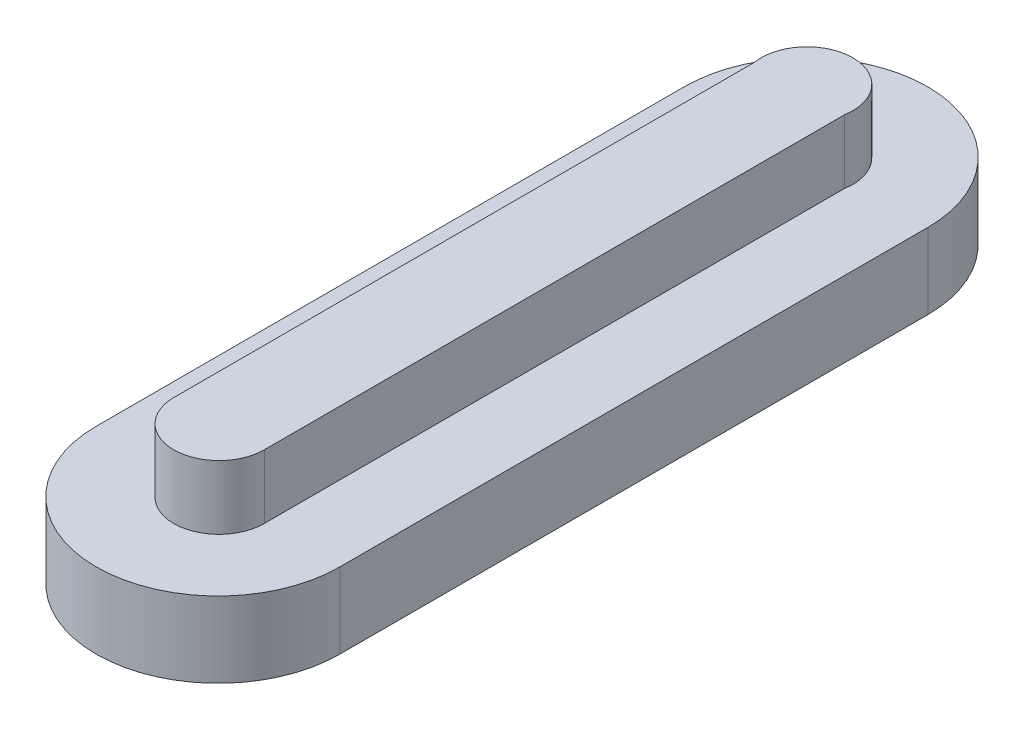
ISO-10303-21;
HEADER;
FILE_DESCRIPTION(('STEP AP214'),'2;1');
FILE_NAME('part.step','',(''),(''),'','','');
FILE_SCHEMA(('AUTOMOTIVE_DESIGN { 1 0 10303 214 1 1 1 1 }'));
ENDSEC;
DATA;
#1=APPLICATION_CONTEXT('core data for automotive mechanical design processes');
#2=APPLICATION_PROTOCOL_DEFINITION('international standard','automotive_design',2000,#1);
#3=PRODUCT_CONTEXT('',#1,'mechanical');
#4=PRODUCT('Part','Part','',(#3));
#5=PRODUCT_RELATED_PRODUCT_CATEGORY('part','',(#4));
#6=PRODUCT_DEFINITION_FORMATION('','',#4);
#7=PRODUCT_DEFINITION_CONTEXT('part definition',#1,'design');
#8=PRODUCT_DEFINITION('design','',#6,#7);
#9=PRODUCT_DEFINITION_SHAPE('','',#8);
#10=(LENGTH_UNIT() NAMED_UNIT(*) SI_UNIT(.MILLI.,.METRE.));
#11=(NAMED_UNIT(*) PLANE_ANGLE_UNIT() SI_UNIT($,.RADIAN.));
#12=(NAMED_UNIT(*) SI_UNIT($,.STERADIAN.) SOLID_ANGLE_UNIT());
#13=UNCERTAINTY_MEASURE_WITH_UNIT(LENGTH_MEASURE(1.E-05),#10,'distance_accuracy_value','');
#14=(GEOMETRIC_REPRESENTATION_CONTEXT(3) GLOBAL_UNCERTAINTY_ASSIGNED_CONTEXT((#13)) GLOBAL_UNIT_ASSIGNED_CONTEXT((#10,
#11,#12)) REPRESENTATION_CONTEXT('',''));
#15=CARTESIAN_POINT('',(0.,0.,0.));
#16=DIRECTION('',(0.,0.,1.));
#17=DIRECTION('',(1.,0.,0.));
#18=AXIS2_PLACEMENT_3D('',#15,#16,#17);
#19=CARTESIAN_POINT('',(0.,4.5,0.));
#20=DIRECTION('',(0.,-1.,0.));
#21=DIRECTION('',(0.,0.,-1.));
#22=AXIS2_PLACEMENT_3D('',#19,#20,#21);
#23=CYLINDRICAL_SURFACE('',#22,7.25);
#24=CARTESIAN_POINT('',(0.,0.,0.));
#25=DIRECTION('',(0.,1.,0.));
#26=DIRECTION('',(0.,0.,1.));
#27=AXIS2_PLACEMENT_3D('',#24,#25,#26);
#28=CIRCLE('',#27,7.25);
#29=CARTESIAN_POINT('',(7.25,0.,0.));
#30=VERTEX_POINT('',#29);
#31=CARTESIAN_POINT('',(-7.25,0.,0.));
#32=VERTEX_POINT('',#31);
#33=EDGE_CURVE('E151',#30,#32,#28,.T.);
#34=ORIENTED_EDGE('',*,*,#33,.T.);
#35=DIRECTION('',(0.,-1.,0.));
#36=VECTOR('',#35,1.);
#37=CARTESIAN_POINT('',(-7.25,4.5,0.));
#38=LINE('',#37,#36);
#39=CARTESIAN_POINT('',(-7.25,4.5,0.));
#40=VERTEX_POINT('',#39);
#41=EDGE_CURVE('E11',#40,#32,#38,.T.);
#42=ORIENTED_EDGE('',*,*,#41,.F.);
#43=CARTESIAN_POINT('',(0.,4.5,0.));
#44=DIRECTION('',(0.,1.,0.));
#45=DIRECTION('',(0.,0.,1.));
#46=AXIS2_PLACEMENT_3D('',#43,#44,#45);
#47=CIRCLE('',#46,7.25);
#48=CARTESIAN_POINT('',(7.25,4.5,0.));
#49=VERTEX_POINT('',#48);
#50=EDGE_CURVE('E152',#49,#40,#47,.T.);
#51=ORIENTED_EDGE('',*,*,#50,.F.);
#52=DIRECTION('',(0.,-1.,0.));
#53=VECTOR('',#52,1.);
#54=CARTESIAN_POINT('',(7.25,4.5,0.));
#55=LINE('',#54,#53);
#56=EDGE_CURVE('E166',#49,#30,#55,.T.);
#57=ORIENTED_EDGE('',*,*,#56,.T.);
#58=EDGE_LOOP('',(#34,#42,#51,#57));
#59=FACE_BOUND('',#58,.T.);
#60=ADVANCED_FACE('F38',(#59),#23,.T.);
#61=CARTESIAN_POINT('',(-7.25,4.5,0.));
#62=DIRECTION('',(1.,0.,0.));
#63=DIRECTION('',(0.,0.,-1.));
#64=AXIS2_PLACEMENT_3D('',#61,#62,#63);
#65=PLANE('',#64);
#66=DIRECTION('',(0.,0.,1.));
#67=VECTOR('',#66,1.);
#68=CARTESIAN_POINT('',(-7.25,0.,0.));
#69=LINE('',#68,#67);
#70=CARTESIAN_POINT('',(-7.24999999999999,0.,35.));
#71=VERTEX_POINT('',#70);
#72=EDGE_CURVE('E170',#32,#71,#69,.T.);
#73=ORIENTED_EDGE('',*,*,#72,.T.);
#74=DIRECTION('',(0.,-1.,0.));
#75=VECTOR('',#74,1.);
#76=CARTESIAN_POINT('',(-7.24999999999999,4.5,35.));
#77=LINE('',#76,#75);
#78=CARTESIAN_POINT('',(-7.24999999999999,4.5,35.));
#79=VERTEX_POINT('',#78);
#80=EDGE_CURVE('E46',#79,#71,#77,.T.);
#81=ORIENTED_EDGE('',*,*,#80,.F.);
#82=DIRECTION('',(0.,0.,1.));
#83=VECTOR('',#82,1.);
#84=CARTESIAN_POINT('',(-7.25,4.5,0.));
#85=LINE('',#84,#83);
#86=EDGE_CURVE('E156',#40,#79,#85,.T.);
#87=ORIENTED_EDGE('',*,*,#86,.F.);
#88=ORIENTED_EDGE('',*,*,#41,.T.);
#89=EDGE_LOOP('',(#73,#81,#87,#88));
#90=FACE_BOUND('',#89,.T.);
#91=ADVANCED_FACE('F206',(#90),#65,.F.);
#92=CARTESIAN_POINT('',(0.,4.5,35.));
#93=DIRECTION('',(0.,-1.,0.));
#94=DIRECTION('',(0.,0.,-1.));
#95=AXIS2_PLACEMENT_3D('',#92,#93,#94);
#96=CYLINDRICAL_SURFACE('',#95,7.25);
#97=CARTESIAN_POINT('',(0.,0.,35.));
#98=DIRECTION('',(0.,1.,0.));
#99=DIRECTION('',(0.,0.,1.));
#100=AXIS2_PLACEMENT_3D('',#97,#98,#99);
#101=CIRCLE('',#100,7.25);
#102=CARTESIAN_POINT('',(7.25,0.,35.));
#103=VERTEX_POINT('',#102);
#104=EDGE_CURVE('E173',#71,#103,#101,.T.);
#105=ORIENTED_EDGE('',*,*,#104,.T.);
#106=DIRECTION('',(0.,-1.,0.));
#107=VECTOR('',#106,1.);
#108=CARTESIAN_POINT('',(7.25,4.5,35.));
#109=LINE('',#108,#107);
#110=CARTESIAN_POINT('',(7.25,4.5,35.));
#111=VERTEX_POINT('',#110);
#112=EDGE_CURVE('E181',#111,#103,#109,.T.);
#113=ORIENTED_EDGE('',*,*,#112,.F.);
#114=CARTESIAN_POINT('',(0.,4.5,35.));
#115=DIRECTION('',(0.,1.,0.));
#116=DIRECTION('',(0.,0.,1.));
#117=AXIS2_PLACEMENT_3D('',#114,#115,#116);
#118=CIRCLE('',#117,7.25);
#119=EDGE_CURVE('E160',#79,#111,#118,.T.);
#120=ORIENTED_EDGE('',*,*,#119,.F.);
#121=ORIENTED_EDGE('',*,*,#80,.T.);
#122=EDGE_LOOP('',(#105,#113,#120,#121));
#123=FACE_BOUND('',#122,.T.);
#124=ADVANCED_FACE('F190',(#123),#96,.T.);
#125=CARTESIAN_POINT('',(7.25,4.5,0.));
#126=DIRECTION('',(-1.,0.,0.));
#127=DIRECTION('',(0.,0.,1.));
#128=AXIS2_PLACEMENT_3D('',#125,#126,#127);
#129=PLANE('',#128);
#130=DIRECTION('',(0.,0.,-1.));
#131=VECTOR('',#130,1.);
#132=CARTESIAN_POINT('',(7.25,0.,0.));
#133=LINE('',#132,#131);
#134=EDGE_CURVE('E157',#103,#30,#133,.T.);
#135=ORIENTED_EDGE('',*,*,#134,.T.);
#136=ORIENTED_EDGE('',*,*,#56,.F.);
#137=DIRECTION('',(0.,0.,-1.));
#138=VECTOR('',#137,1.);
#139=CARTESIAN_POINT('',(7.25,4.5,0.));
#140=LINE('',#139,#138);
#141=EDGE_CURVE('E163',#111,#49,#140,.T.);
#142=ORIENTED_EDGE('',*,*,#141,.F.);
#143=ORIENTED_EDGE('',*,*,#112,.T.);
#144=EDGE_LOOP('',(#135,#136,#142,#143));
#145=FACE_BOUND('',#144,.T.);
#146=ADVANCED_FACE('F199',(#145),#129,.F.);
#147=CARTESIAN_POINT('',(0.,4.5,0.));
#148=DIRECTION('',(0.,1.,0.));
#149=DIRECTION('',(0.,0.,1.));
#150=AXIS2_PLACEMENT_3D('',#147,#148,#149);
#151=PLANE('',#150);
#152=CARTESIAN_POINT('',(0.0706103890184494,4.5,0.0112960812225504));
#153=DIRECTION('',(0.,1.,0.));
#154=DIRECTION('',(0.,0.,1.));
#155=AXIS2_PLACEMENT_3D('',#152,#153,#154);
#156=CIRCLE('',#155,2.72992224514324);
#157=CARTESIAN_POINT('',(2.76379226914791,4.5,0.457666807267897));
#158=VERTEX_POINT('',#157);
#159=CARTESIAN_POINT('',(-2.62257149111101,4.5,0.457666807267911));
#160=VERTEX_POINT('',#159);
#161=EDGE_CURVE('E53',#158,#160,#156,.T.);
#162=ORIENTED_EDGE('',*,*,#161,.F.);
#163=DIRECTION('',(0.,0.,1.));
#164=VECTOR('',#163,1.);
#165=CARTESIAN_POINT('',(2.76379226914791,4.5,0.));
#166=LINE('',#165,#164);
#167=CARTESIAN_POINT('',(2.76379226914791,4.5,35.0112960812226));
#168=VERTEX_POINT('',#167);
#169=EDGE_CURVE('E58',#158,#168,#166,.T.);
#170=ORIENTED_EDGE('',*,*,#169,.T.);
#171=CARTESIAN_POINT('',(0.0706103890184538,4.5,35.0112960812226));
#172=DIRECTION('',(0.,1.,0.));
#173=DIRECTION('',(0.,0.,1.));
#174=AXIS2_PLACEMENT_3D('',#171,#172,#173);
#175=CIRCLE('',#174,2.69318188012946);
#176=CARTESIAN_POINT('',(-2.622571491111,4.5,35.0112960812226));
#177=VERTEX_POINT('',#176);
#178=EDGE_CURVE('E129',#177,#168,#175,.T.);
#179=ORIENTED_EDGE('',*,*,#178,.F.);
#180=DIRECTION('',(0.,0.,1.));
#181=VECTOR('',#180,1.);
#182=CARTESIAN_POINT('',(-2.62257149111101,4.5,0.));
#183=LINE('',#182,#181);
#184=EDGE_CURVE('E136',#160,#177,#183,.T.);
#185=ORIENTED_EDGE('',*,*,#184,.F.);
#186=EDGE_LOOP('',(#162,#170,#179,#185));
#187=FACE_BOUND('',#186,.T.);
#188=ORIENTED_EDGE('',*,*,#50,.T.);
#189=ORIENTED_EDGE('',*,*,#86,.T.);
#190=ORIENTED_EDGE('',*,*,#119,.T.);
#191=ORIENTED_EDGE('',*,*,#141,.T.);
#192=EDGE_LOOP('',(#188,#189,#190,#191));
#193=FACE_BOUND('',#192,.T.);
#194=ADVANCED_FACE('F205',(#187,#193),#151,.T.);
#195=CARTESIAN_POINT('',(0.,0.,0.));
#196=DIRECTION('',(0.,1.,0.));
#197=DIRECTION('',(0.,0.,1.));
#198=AXIS2_PLACEMENT_3D('',#195,#196,#197);
#199=PLANE('',#198);
#200=ORIENTED_EDGE('',*,*,#33,.F.);
#201=ORIENTED_EDGE('',*,*,#134,.F.);
#202=ORIENTED_EDGE('',*,*,#104,.F.);
#203=ORIENTED_EDGE('',*,*,#72,.F.);
#204=EDGE_LOOP('',(#200,#201,#202,#203));
#205=FACE_BOUND('',#204,.T.);
#206=ADVANCED_FACE('F196',(#205),#199,.F.);
#207=CARTESIAN_POINT('',(0.0706103890184494,8.3,0.0112960812225504));
#208=DIRECTION('',(0.,-1.,0.));
#209=DIRECTION('',(0.,0.,-1.));
#210=AXIS2_PLACEMENT_3D('',#207,#208,#209);
#211=CYLINDRICAL_SURFACE('',#210,2.72992224514324);
#212=ORIENTED_EDGE('',*,*,#161,.T.);
#213=DIRECTION('',(0.,-1.,0.));
#214=VECTOR('',#213,1.);
#215=CARTESIAN_POINT('',(-2.62257149111101,8.3,0.457666807267911));
#216=LINE('',#215,#214);
#217=CARTESIAN_POINT('',(-2.62257149111101,8.3,0.457666807267911));
#218=VERTEX_POINT('',#217);
#219=EDGE_CURVE('E122',#218,#160,#216,.T.);
#220=ORIENTED_EDGE('',*,*,#219,.F.);
#221=CARTESIAN_POINT('',(0.0706103890184494,8.3,0.0112960812225504));
#222=DIRECTION('',(0.,1.,0.));
#223=DIRECTION('',(0.,0.,1.));
#224=AXIS2_PLACEMENT_3D('',#221,#222,#223);
#225=CIRCLE('',#224,2.72992224514324);
#226=CARTESIAN_POINT('',(2.76379226914791,8.3,0.457666807267897));
#227=VERTEX_POINT('',#226);
#228=EDGE_CURVE('E105',#227,#218,#225,.T.);
#229=ORIENTED_EDGE('',*,*,#228,.F.);
#230=DIRECTION('',(0.,-1.,0.));
#231=VECTOR('',#230,1.);
#232=CARTESIAN_POINT('',(2.76379226914791,8.3,0.457666807267897));
#233=LINE('',#232,#231);
#234=EDGE_CURVE('E112',#227,#158,#233,.T.);
#235=ORIENTED_EDGE('',*,*,#234,.T.);
#236=EDGE_LOOP('',(#212,#220,#229,#235));
#237=FACE_BOUND('',#236,.T.);
#238=ADVANCED_FACE('F120',(#237),#211,.T.);
#239=CARTESIAN_POINT('',(-2.62257149111101,8.3,0.));
#240=DIRECTION('',(1.,0.,0.));
#241=DIRECTION('',(0.,0.,-1.));
#242=AXIS2_PLACEMENT_3D('',#239,#240,#241);
#243=PLANE('',#242);
#244=ORIENTED_EDGE('',*,*,#184,.T.);
#245=DIRECTION('',(0.,-1.,0.));
#246=VECTOR('',#245,1.);
#247=CARTESIAN_POINT('',(-2.622571491111,8.3,35.0112960812226));
#248=LINE('',#247,#246);
#249=CARTESIAN_POINT('',(-2.62257149111101,8.3,35.0112960812226));
#250=VERTEX_POINT('',#249);
#251=EDGE_CURVE('E145',#250,#177,#248,.T.);
#252=ORIENTED_EDGE('',*,*,#251,.F.);
#253=DIRECTION('',(0.,0.,1.));
#254=VECTOR('',#253,1.);
#255=CARTESIAN_POINT('',(-2.62257149111101,8.3,0.));
#256=LINE('',#255,#254);
#257=EDGE_CURVE('E124',#218,#250,#256,.T.);
#258=ORIENTED_EDGE('',*,*,#257,.F.);
#259=ORIENTED_EDGE('',*,*,#219,.T.);
#260=EDGE_LOOP('',(#244,#252,#258,#259));
#261=FACE_BOUND('',#260,.T.);
#262=ADVANCED_FACE('F222',(#261),#243,.F.);
#263=CARTESIAN_POINT('',(0.0706103890184538,8.3,35.0112960812226));
#264=DIRECTION('',(0.,-1.,0.));
#265=DIRECTION('',(0.,0.,-1.));
#266=AXIS2_PLACEMENT_3D('',#263,#264,#265);
#267=CYLINDRICAL_SURFACE('',#266,2.69318188012946);
#268=ORIENTED_EDGE('',*,*,#178,.T.);
#269=DIRECTION('',(0.,-1.,0.));
#270=VECTOR('',#269,1.);
#271=CARTESIAN_POINT('',(2.76379226914791,8.3,35.0112960812226));
#272=LINE('',#271,#270);
#273=CARTESIAN_POINT('',(2.76379226914791,8.3,35.0112960812226));
#274=VERTEX_POINT('',#273);
#275=EDGE_CURVE('E117',#274,#168,#272,.T.);
#276=ORIENTED_EDGE('',*,*,#275,.F.);
#277=CARTESIAN_POINT('',(0.0706103890184538,8.3,35.0112960812226));
#278=DIRECTION('',(0.,1.,0.));
#279=DIRECTION('',(0.,0.,1.));
#280=AXIS2_PLACEMENT_3D('',#277,#278,#279);
#281=CIRCLE('',#280,2.69318188012946);
#282=EDGE_CURVE('E108',#250,#274,#281,.T.);
#283=ORIENTED_EDGE('',*,*,#282,.F.);
#284=ORIENTED_EDGE('',*,*,#251,.T.);
#285=EDGE_LOOP('',(#268,#276,#283,#284));
#286=FACE_BOUND('',#285,.T.);
#287=ADVANCED_FACE('F225',(#286),#267,.T.);
#288=CARTESIAN_POINT('',(2.76379226914791,8.3,0.));
#289=DIRECTION('',(1.,0.,0.));
#290=DIRECTION('',(0.,0.,-1.));
#291=AXIS2_PLACEMENT_3D('',#288,#289,#290);
#292=PLANE('',#291);
#293=ORIENTED_EDGE('',*,*,#169,.F.);
#294=ORIENTED_EDGE('',*,*,#234,.F.);
#295=DIRECTION('',(0.,0.,1.));
#296=VECTOR('',#295,1.);
#297=CARTESIAN_POINT('',(2.76379226914791,8.3,0.));
#298=LINE('',#297,#296);
#299=EDGE_CURVE('E101',#227,#274,#298,.T.);
#300=ORIENTED_EDGE('',*,*,#299,.T.);
#301=ORIENTED_EDGE('',*,*,#275,.T.);
#302=EDGE_LOOP('',(#293,#294,#300,#301));
#303=FACE_BOUND('',#302,.T.);
#304=ADVANCED_FACE('F114',(#303),#292,.T.);
#305=CARTESIAN_POINT('',(0.,8.3,0.));
#306=DIRECTION('',(0.,1.,0.));
#307=DIRECTION('',(0.,0.,1.));
#308=AXIS2_PLACEMENT_3D('',#305,#306,#307);
#309=PLANE('',#308);
#310=ORIENTED_EDGE('',*,*,#228,.T.);
#311=ORIENTED_EDGE('',*,*,#257,.T.);
#312=ORIENTED_EDGE('',*,*,#282,.T.);
#313=ORIENTED_EDGE('',*,*,#299,.F.);
#314=EDGE_LOOP('',(#310,#311,#312,#313));
#315=FACE_BOUND('',#314,.T.);
#316=ADVANCED_FACE('F103',(#315),#309,.T.);
#317=CLOSED_SHELL('',(#60,#91,#124,#146,#194,#206,#238,#262,#287,#304,#316));
#318=MANIFOLD_SOLID_BREP('B2',#317);
#319=ADVANCED_BREP_SHAPE_REPRESENTATION('',(#18,#318),#14);
#320=SHAPE_DEFINITION_REPRESENTATION(#9,#319);
ENDSEC;
END-ISO-10303-21;
